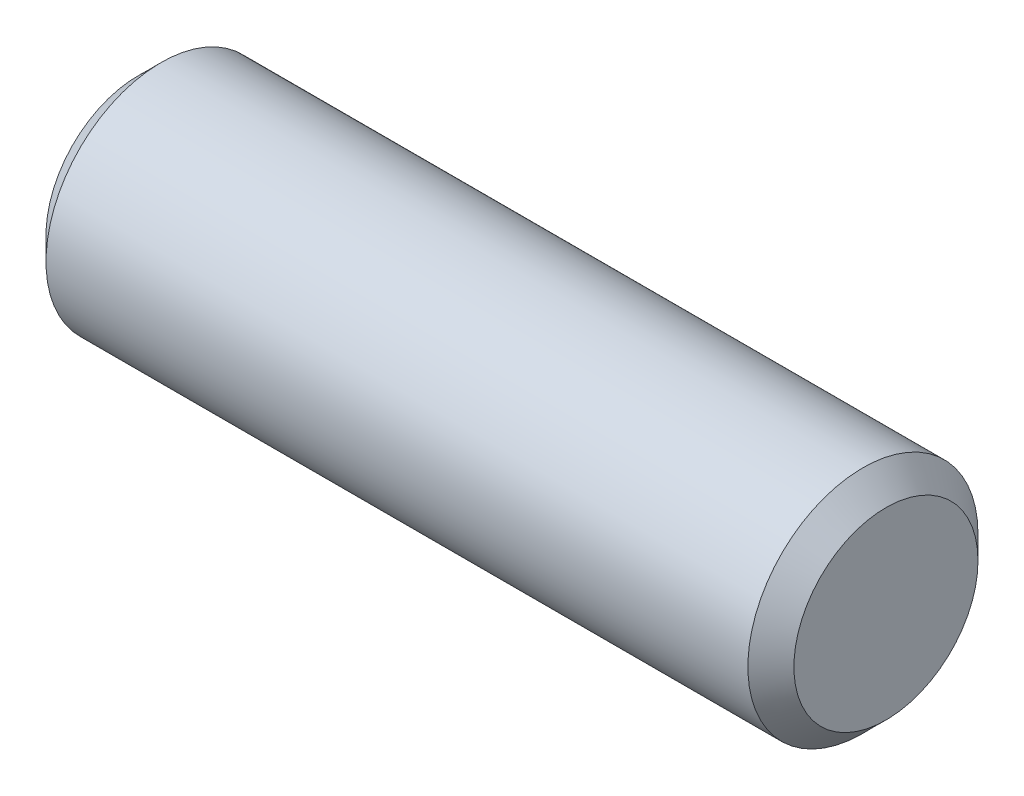
ISO-10303-21;
HEADER;
FILE_DESCRIPTION(('STEP AP214'),'2;1');
FILE_NAME('part.step','',(''),(''),'','','');
FILE_SCHEMA(('AUTOMOTIVE_DESIGN { 1 0 10303 214 1 1 1 1 }'));
ENDSEC;
DATA;
#1=APPLICATION_CONTEXT('core data for automotive mechanical design processes');
#2=APPLICATION_PROTOCOL_DEFINITION('international standard','automotive_design',2000,#1);
#3=PRODUCT_CONTEXT('',#1,'mechanical');
#4=PRODUCT('Part','Part','',(#3));
#5=PRODUCT_RELATED_PRODUCT_CATEGORY('part','',(#4));
#6=PRODUCT_DEFINITION_FORMATION('','',#4);
#7=PRODUCT_DEFINITION_CONTEXT('part definition',#1,'design');
#8=PRODUCT_DEFINITION('design','',#6,#7);
#9=PRODUCT_DEFINITION_SHAPE('','',#8);
#10=(LENGTH_UNIT() NAMED_UNIT(*) SI_UNIT(.MILLI.,.METRE.));
#11=(NAMED_UNIT(*) PLANE_ANGLE_UNIT() SI_UNIT($,.RADIAN.));
#12=(NAMED_UNIT(*) SI_UNIT($,.STERADIAN.) SOLID_ANGLE_UNIT());
#13=UNCERTAINTY_MEASURE_WITH_UNIT(LENGTH_MEASURE(1.E-05),#10,'distance_accuracy_value','');
#14=(GEOMETRIC_REPRESENTATION_CONTEXT(3) GLOBAL_UNCERTAINTY_ASSIGNED_CONTEXT((#13)) GLOBAL_UNIT_ASSIGNED_CONTEXT((#10,
#11,#12)) REPRESENTATION_CONTEXT('',''));
#15=CARTESIAN_POINT('',(0.,0.,0.));
#16=DIRECTION('',(0.,0.,1.));
#17=DIRECTION('',(1.,0.,0.));
#18=AXIS2_PLACEMENT_3D('',#15,#16,#17);
#19=CARTESIAN_POINT('',(-19.3675,0.,0.));
#20=DIRECTION('',(1.,0.,0.));
#21=DIRECTION('',(0.,0.,-1.));
#22=AXIS2_PLACEMENT_3D('',#19,#20,#21);
#23=CONICAL_SURFACE('',#22,6.35,0.785398163397449);
#24=CARTESIAN_POINT('',(-19.3675,0.,0.));
#25=DIRECTION('',(1.,0.,0.));
#26=DIRECTION('',(0.,0.,-1.));
#27=AXIS2_PLACEMENT_3D('',#24,#25,#26);
#28=CIRCLE('',#27,6.35);
#29=CARTESIAN_POINT('',(-19.3675,0.,-6.35));
#30=VERTEX_POINT('',#29);
#31=EDGE_CURVE('E42',#30,#30,#28,.T.);
#32=ORIENTED_EDGE('',*,*,#31,.F.);
#33=EDGE_LOOP('',(#32));
#34=FACE_BOUND('',#33,.T.);
#35=CARTESIAN_POINT('',(-20.6375,0.,0.));
#36=DIRECTION('',(-1.,0.,0.));
#37=DIRECTION('',(0.,0.,-1.));
#38=AXIS2_PLACEMENT_3D('',#35,#36,#37);
#39=CIRCLE('',#38,5.08);
#40=CARTESIAN_POINT('',(-20.6375,0.,-5.08));
#41=VERTEX_POINT('',#40);
#42=EDGE_CURVE('E24',#41,#41,#39,.T.);
#43=ORIENTED_EDGE('',*,*,#42,.F.);
#44=EDGE_LOOP('',(#43));
#45=FACE_BOUND('',#44,.T.);
#46=ADVANCED_FACE('F17',(#34,#45),#23,.T.);
#47=CARTESIAN_POINT('',(20.6375,0.,0.));
#48=DIRECTION('',(-1.,0.,0.));
#49=DIRECTION('',(0.,0.,1.));
#50=AXIS2_PLACEMENT_3D('',#47,#48,#49);
#51=CONICAL_SURFACE('',#50,5.08,0.785398163397448);
#52=CARTESIAN_POINT('',(20.6375,0.,0.));
#53=DIRECTION('',(1.,0.,0.));
#54=DIRECTION('',(0.,0.,-1.));
#55=AXIS2_PLACEMENT_3D('',#52,#53,#54);
#56=CIRCLE('',#55,5.08);
#57=CARTESIAN_POINT('',(20.6375,0.,-5.08));
#58=VERTEX_POINT('',#57);
#59=EDGE_CURVE('E11',#58,#58,#56,.T.);
#60=ORIENTED_EDGE('',*,*,#59,.F.);
#61=EDGE_LOOP('',(#60));
#62=FACE_BOUND('',#61,.T.);
#63=CARTESIAN_POINT('',(19.3675,0.,0.));
#64=DIRECTION('',(-1.,0.,0.));
#65=DIRECTION('',(0.,0.,-1.));
#66=AXIS2_PLACEMENT_3D('',#63,#64,#65);
#67=CIRCLE('',#66,6.35);
#68=CARTESIAN_POINT('',(19.3675,0.,-6.35));
#69=VERTEX_POINT('',#68);
#70=EDGE_CURVE('E39',#69,#69,#67,.T.);
#71=ORIENTED_EDGE('',*,*,#70,.F.);
#72=EDGE_LOOP('',(#71));
#73=FACE_BOUND('',#72,.T.);
#74=ADVANCED_FACE('F50',(#62,#73),#51,.T.);
#75=CARTESIAN_POINT('',(20.6375,0.,0.));
#76=DIRECTION('',(1.,0.,0.));
#77=DIRECTION('',(0.,0.,-1.));
#78=AXIS2_PLACEMENT_3D('',#75,#76,#77);
#79=PLANE('',#78);
#80=ORIENTED_EDGE('',*,*,#59,.T.);
#81=EDGE_LOOP('',(#80));
#82=FACE_BOUND('',#81,.T.);
#83=ADVANCED_FACE('F55',(#82),#79,.T.);
#84=CARTESIAN_POINT('',(-20.6375,0.,0.));
#85=DIRECTION('',(1.,0.,0.));
#86=DIRECTION('',(0.,0.,-1.));
#87=AXIS2_PLACEMENT_3D('',#84,#85,#86);
#88=PLANE('',#87);
#89=ORIENTED_EDGE('',*,*,#42,.T.);
#90=EDGE_LOOP('',(#89));
#91=FACE_BOUND('',#90,.T.);
#92=ADVANCED_FACE('F60',(#91),#88,.F.);
#93=CARTESIAN_POINT('',(-20.6375,0.,0.));
#94=DIRECTION('',(-1.,0.,0.));
#95=DIRECTION('',(0.,0.,-1.));
#96=AXIS2_PLACEMENT_3D('',#93,#94,#95);
#97=CYLINDRICAL_SURFACE('',#96,6.35);
#98=ORIENTED_EDGE('',*,*,#31,.T.);
#99=EDGE_LOOP('',(#98));
#100=FACE_BOUND('',#99,.T.);
#101=ORIENTED_EDGE('',*,*,#70,.T.);
#102=EDGE_LOOP('',(#101));
#103=FACE_BOUND('',#102,.T.);
#104=ADVANCED_FACE('F40',(#100,#103),#97,.T.);
#105=CLOSED_SHELL('',(#46,#74,#83,#92,#104));
#106=MANIFOLD_SOLID_BREP('B1',#105);
#107=ADVANCED_BREP_SHAPE_REPRESENTATION('',(#18,#106),#14);
#108=SHAPE_DEFINITION_REPRESENTATION(#9,#107);
ENDSEC;
END-ISO-10303-21;
